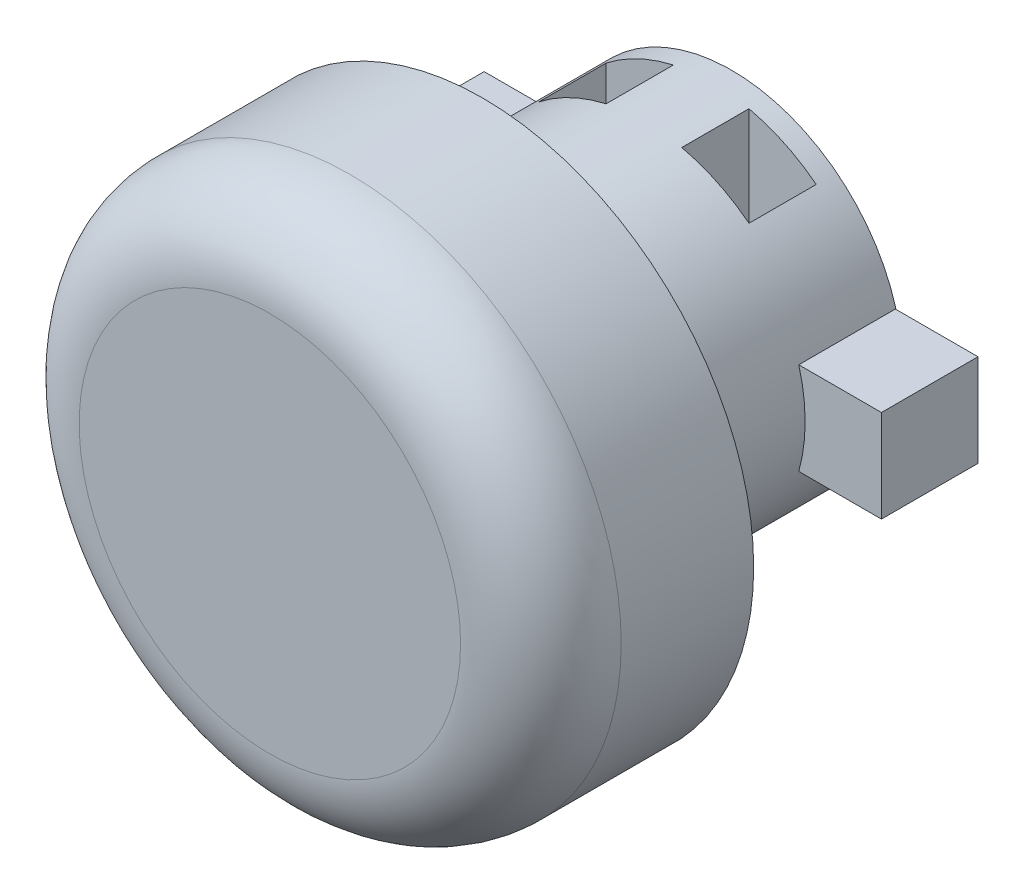
ISO-10303-21;
HEADER;
FILE_DESCRIPTION(('STEP AP214'),'2;1');
FILE_NAME('part.step','',(''),(''),'','','');
FILE_SCHEMA(('AUTOMOTIVE_DESIGN { 1 0 10303 214 1 1 1 1 }'));
ENDSEC;
DATA;
#1=APPLICATION_CONTEXT('core data for automotive mechanical design processes');
#2=APPLICATION_PROTOCOL_DEFINITION('international standard','automotive_design',2000,#1);
#3=PRODUCT_CONTEXT('',#1,'mechanical');
#4=PRODUCT('Part','Part','',(#3));
#5=PRODUCT_RELATED_PRODUCT_CATEGORY('part','',(#4));
#6=PRODUCT_DEFINITION_FORMATION('','',#4);
#7=PRODUCT_DEFINITION_CONTEXT('part definition',#1,'design');
#8=PRODUCT_DEFINITION('design','',#6,#7);
#9=PRODUCT_DEFINITION_SHAPE('','',#8);
#10=(LENGTH_UNIT() NAMED_UNIT(*) SI_UNIT(.MILLI.,.METRE.));
#11=(NAMED_UNIT(*) PLANE_ANGLE_UNIT() SI_UNIT($,.RADIAN.));
#12=(NAMED_UNIT(*) SI_UNIT($,.STERADIAN.) SOLID_ANGLE_UNIT());
#13=UNCERTAINTY_MEASURE_WITH_UNIT(LENGTH_MEASURE(1.E-05),#10,'distance_accuracy_value','');
#14=(GEOMETRIC_REPRESENTATION_CONTEXT(3) GLOBAL_UNCERTAINTY_ASSIGNED_CONTEXT((#13)) GLOBAL_UNIT_ASSIGNED_CONTEXT((#10,
#11,#12)) REPRESENTATION_CONTEXT('',''));
#15=CARTESIAN_POINT('',(0.,0.,0.));
#16=DIRECTION('',(0.,0.,1.));
#17=DIRECTION('',(1.,0.,0.));
#18=AXIS2_PLACEMENT_3D('',#15,#16,#17);
#19=CARTESIAN_POINT('',(0.,0.,76.));
#20=DIRECTION('',(0.,0.,-1.));
#21=DIRECTION('',(-1.,0.,0.));
#22=AXIS2_PLACEMENT_3D('',#19,#20,#21);
#23=CYLINDRICAL_SURFACE('',#22,42.5);
#24=CARTESIAN_POINT('',(0.,0.,5.08877359504198));
#25=DIRECTION('',(0.,0.,-1.));
#26=DIRECTION('',(-1.,0.,0.));
#27=AXIS2_PLACEMENT_3D('',#24,#25,#26);
#28=CIRCLE('',#27,42.5);
#29=CARTESIAN_POINT('',(-26.1728970811276,33.4847645710807,5.08877359504198));
#30=VERTEX_POINT('',#29);
#31=CARTESIAN_POINT('',(-9.42224294920593,41.442385763927,5.08877359504198));
#32=VERTEX_POINT('',#31);
#33=EDGE_CURVE('E181',#30,#32,#28,.T.);
#34=ORIENTED_EDGE('',*,*,#33,.T.);
#35=DIRECTION('',(0.,0.,-1.));
#36=VECTOR('',#35,1.);
#37=CARTESIAN_POINT('',(-9.42224294920593,41.442385763927,76.));
#38=LINE('',#37,#36);
#39=CARTESIAN_POINT('',(-9.42224294920593,41.442385763927,21.8394277269636));
#40=VERTEX_POINT('',#39);
#41=EDGE_CURVE('E11',#32,#40,#38,.F.);
#42=ORIENTED_EDGE('',*,*,#41,.T.);
#43=CARTESIAN_POINT('',(0.,0.,21.8394277269636));
#44=DIRECTION('',(0.,0.,1.));
#45=DIRECTION('',(1.,0.,0.));
#46=AXIS2_PLACEMENT_3D('',#43,#44,#45);
#47=CIRCLE('',#46,42.5);
#48=CARTESIAN_POINT('',(-26.1728970811276,33.4847645710807,21.8394277269636));
#49=VERTEX_POINT('',#48);
#50=EDGE_CURVE('E40',#40,#49,#47,.T.);
#51=ORIENTED_EDGE('',*,*,#50,.T.);
#52=DIRECTION('',(0.,0.,-1.));
#53=VECTOR('',#52,1.);
#54=CARTESIAN_POINT('',(-26.1728970811276,33.4847645710807,76.));
#55=LINE('',#54,#53);
#56=EDGE_CURVE('E189',#49,#30,#55,.T.);
#57=ORIENTED_EDGE('',*,*,#56,.T.);
#58=EDGE_LOOP('',(#34,#42,#51,#57));
#59=FACE_BOUND('',#58,.T.);
#60=CARTESIAN_POINT('',(-26.1728970811276,-33.4847645710807,21.8394277269636));
#61=VERTEX_POINT('',#60);
#62=CARTESIAN_POINT('',(-9.42224294920593,-41.442385763927,21.8394277269636));
#63=VERTEX_POINT('',#62);
#64=EDGE_CURVE('E184',#61,#63,#47,.T.);
#65=ORIENTED_EDGE('',*,*,#64,.T.);
#66=DIRECTION('',(0.,0.,-1.));
#67=VECTOR('',#66,1.);
#68=CARTESIAN_POINT('',(-9.42224294920593,-41.442385763927,76.));
#69=LINE('',#68,#67);
#70=CARTESIAN_POINT('',(-9.42224294920593,-41.442385763927,5.08877359504198));
#71=VERTEX_POINT('',#70);
#72=EDGE_CURVE('E187',#63,#71,#69,.T.);
#73=ORIENTED_EDGE('',*,*,#72,.T.);
#74=CARTESIAN_POINT('',(-26.1728970811276,-33.4847645710807,5.08877359504198));
#75=VERTEX_POINT('',#74);
#76=EDGE_CURVE('E177',#71,#75,#28,.T.);
#77=ORIENTED_EDGE('',*,*,#76,.T.);
#78=DIRECTION('',(0.,0.,-1.));
#79=VECTOR('',#78,1.);
#80=CARTESIAN_POINT('',(-26.1728970811276,-33.4847645710807,76.));
#81=LINE('',#80,#79);
#82=EDGE_CURVE('E180',#75,#61,#81,.F.);
#83=ORIENTED_EDGE('',*,*,#82,.T.);
#84=EDGE_LOOP('',(#65,#73,#77,#83));
#85=FACE_BOUND('',#84,.T.);
#86=CARTESIAN_POINT('',(0.,0.,5.08877359504198));
#87=DIRECTION('',(0.,0.,-1.));
#88=DIRECTION('',(-1.,0.,0.));
#89=AXIS2_PLACEMENT_3D('',#86,#87,#88);
#90=CIRCLE('',#89,42.5);
#91=CARTESIAN_POINT('',(9.42224294920593,41.442385763927,5.08877359504198));
#92=VERTEX_POINT('',#91);
#93=CARTESIAN_POINT('',(26.1728970811276,33.4847645710807,5.08877359504198));
#94=VERTEX_POINT('',#93);
#95=EDGE_CURVE('E143',#92,#94,#90,.T.);
#96=ORIENTED_EDGE('',*,*,#95,.T.);
#97=DIRECTION('',(0.,0.,-1.));
#98=VECTOR('',#97,1.);
#99=CARTESIAN_POINT('',(26.1728970811276,33.4847645710807,76.));
#100=LINE('',#99,#98);
#101=CARTESIAN_POINT('',(26.1728970811276,33.4847645710807,21.8394277269636));
#102=VERTEX_POINT('',#101);
#103=EDGE_CURVE('E171',#94,#102,#100,.F.);
#104=ORIENTED_EDGE('',*,*,#103,.T.);
#105=CARTESIAN_POINT('',(0.,0.,21.8394277269636));
#106=DIRECTION('',(0.,0.,1.));
#107=DIRECTION('',(1.,0.,0.));
#108=AXIS2_PLACEMENT_3D('',#105,#106,#107);
#109=CIRCLE('',#108,42.5);
#110=CARTESIAN_POINT('',(9.42224294920593,41.442385763927,21.8394277269636));
#111=VERTEX_POINT('',#110);
#112=EDGE_CURVE('E169',#102,#111,#109,.T.);
#113=ORIENTED_EDGE('',*,*,#112,.T.);
#114=DIRECTION('',(0.,0.,-1.));
#115=VECTOR('',#114,1.);
#116=CARTESIAN_POINT('',(9.42224294920593,41.442385763927,76.));
#117=LINE('',#116,#115);
#118=EDGE_CURVE('E154',#111,#92,#117,.T.);
#119=ORIENTED_EDGE('',*,*,#118,.T.);
#120=EDGE_LOOP('',(#96,#104,#113,#119));
#121=FACE_BOUND('',#120,.T.);
#122=CARTESIAN_POINT('',(9.42224294920593,-41.442385763927,21.8394277269636));
#123=VERTEX_POINT('',#122);
#124=CARTESIAN_POINT('',(26.1728970811276,-33.4847645710807,21.8394277269636));
#125=VERTEX_POINT('',#124);
#126=EDGE_CURVE('E173',#123,#125,#109,.T.);
#127=ORIENTED_EDGE('',*,*,#126,.T.);
#128=DIRECTION('',(0.,0.,-1.));
#129=VECTOR('',#128,1.);
#130=CARTESIAN_POINT('',(26.1728970811276,-33.4847645710807,76.));
#131=LINE('',#130,#129);
#132=CARTESIAN_POINT('',(26.1728970811276,-33.4847645710807,5.08877359504198));
#133=VERTEX_POINT('',#132);
#134=EDGE_CURVE('E155',#125,#133,#131,.T.);
#135=ORIENTED_EDGE('',*,*,#134,.T.);
#136=CARTESIAN_POINT('',(9.42224294920593,-41.442385763927,5.08877359504198));
#137=VERTEX_POINT('',#136);
#138=EDGE_CURVE('E157',#133,#137,#90,.T.);
#139=ORIENTED_EDGE('',*,*,#138,.T.);
#140=DIRECTION('',(0.,0.,-1.));
#141=VECTOR('',#140,1.);
#142=CARTESIAN_POINT('',(9.42224294920593,-41.442385763927,76.));
#143=LINE('',#142,#141);
#144=EDGE_CURVE('E163',#137,#123,#143,.F.);
#145=ORIENTED_EDGE('',*,*,#144,.T.);
#146=EDGE_LOOP('',(#127,#135,#139,#145));
#147=FACE_BOUND('',#146,.T.);
#148=DIRECTION('',(0.,0.,-1.));
#149=VECTOR('',#148,1.);
#150=CARTESIAN_POINT('',(40.9145450909576,11.5,76.));
#151=LINE('',#150,#149);
#152=CARTESIAN_POINT('',(40.9145450909576,11.5,0.130864485405641));
#153=VERTEX_POINT('',#152);
#154=CARTESIAN_POINT('',(40.9145450909576,11.5,24.1800471284872));
#155=VERTEX_POINT('',#154);
#156=EDGE_CURVE('E280',#153,#155,#151,.F.);
#157=ORIENTED_EDGE('',*,*,#156,.F.);
#158=CARTESIAN_POINT('',(0.,0.,0.130864485405641));
#159=DIRECTION('',(0.,0.,1.));
#160=DIRECTION('',(1.,0.,0.));
#161=AXIS2_PLACEMENT_3D('',#158,#159,#160);
#162=CIRCLE('',#161,42.5);
#163=CARTESIAN_POINT('',(40.9145450909576,-11.5,0.130864485405641));
#164=VERTEX_POINT('',#163);
#165=EDGE_CURVE('E277',#164,#153,#162,.T.);
#166=ORIENTED_EDGE('',*,*,#165,.F.);
#167=DIRECTION('',(0.,0.,-1.));
#168=VECTOR('',#167,1.);
#169=CARTESIAN_POINT('',(40.9145450909576,-11.5,76.));
#170=LINE('',#169,#168);
#171=CARTESIAN_POINT('',(40.9145450909576,-11.5,24.1800471284872));
#172=VERTEX_POINT('',#171);
#173=EDGE_CURVE('E271',#164,#172,#170,.F.);
#174=ORIENTED_EDGE('',*,*,#173,.T.);
#175=CARTESIAN_POINT('',(0.,0.,24.1800471284872));
#176=DIRECTION('',(0.,0.,-1.));
#177=DIRECTION('',(-1.,0.,0.));
#178=AXIS2_PLACEMENT_3D('',#175,#176,#177);
#179=CIRCLE('',#178,42.5);
#180=EDGE_CURVE('E274',#155,#172,#179,.T.);
#181=ORIENTED_EDGE('',*,*,#180,.F.);
#182=EDGE_LOOP('',(#157,#166,#174,#181));
#183=FACE_BOUND('',#182,.T.);
#184=CARTESIAN_POINT('',(0.,0.,76.));
#185=DIRECTION('',(0.,0.,1.));
#186=DIRECTION('',(1.,0.,0.));
#187=AXIS2_PLACEMENT_3D('',#184,#185,#186);
#188=CIRCLE('',#187,42.5);
#189=CARTESIAN_POINT('',(42.5,0.,76.));
#190=VERTEX_POINT('',#189);
#191=EDGE_CURVE('E260',#190,#190,#188,.T.);
#192=ORIENTED_EDGE('',*,*,#191,.F.);
#193=EDGE_LOOP('',(#192));
#194=FACE_BOUND('',#193,.T.);
#195=CARTESIAN_POINT('',(0.,0.,0.));
#196=DIRECTION('',(0.,0.,1.));
#197=DIRECTION('',(1.,0.,0.));
#198=AXIS2_PLACEMENT_3D('',#195,#196,#197);
#199=CIRCLE('',#198,42.5);
#200=CARTESIAN_POINT('',(42.5,0.,0.));
#201=VERTEX_POINT('',#200);
#202=EDGE_CURVE('E259',#201,#201,#199,.T.);
#203=ORIENTED_EDGE('',*,*,#202,.T.);
#204=EDGE_LOOP('',(#203));
#205=FACE_BOUND('',#204,.T.);
#206=DIRECTION('',(0.,0.,-1.));
#207=VECTOR('',#206,1.);
#208=CARTESIAN_POINT('',(-40.9145450909576,11.5,76.));
#209=LINE('',#208,#207);
#210=CARTESIAN_POINT('',(-40.9145450909576,11.5,24.1800471284872));
#211=VERTEX_POINT('',#210);
#212=CARTESIAN_POINT('',(-40.9145450909576,11.5,0.130864485405641));
#213=VERTEX_POINT('',#212);
#214=EDGE_CURVE('E286',#211,#213,#209,.T.);
#215=ORIENTED_EDGE('',*,*,#214,.F.);
#216=CARTESIAN_POINT('',(-40.9145450909576,-11.5,24.1800471284872));
#217=VERTEX_POINT('',#216);
#218=EDGE_CURVE('E278',#217,#211,#179,.T.);
#219=ORIENTED_EDGE('',*,*,#218,.F.);
#220=DIRECTION('',(0.,0.,-1.));
#221=VECTOR('',#220,1.);
#222=CARTESIAN_POINT('',(-40.9145450909576,-11.5,76.));
#223=LINE('',#222,#221);
#224=CARTESIAN_POINT('',(-40.9145450909576,-11.5,0.130864485405641));
#225=VERTEX_POINT('',#224);
#226=EDGE_CURVE('E283',#217,#225,#223,.T.);
#227=ORIENTED_EDGE('',*,*,#226,.T.);
#228=EDGE_CURVE('E281',#213,#225,#162,.T.);
#229=ORIENTED_EDGE('',*,*,#228,.F.);
#230=EDGE_LOOP('',(#215,#219,#227,#229));
#231=FACE_BOUND('',#230,.T.);
#232=ADVANCED_FACE('F32',(#59,#85,#121,#147,#183,#194,#205,#231),#23,.T.);
#233=CARTESIAN_POINT('',(0.,0.,115.));
#234=DIRECTION('',(0.,0.,-1.));
#235=DIRECTION('',(-1.,0.,0.));
#236=AXIS2_PLACEMENT_3D('',#233,#234,#235);
#237=CYLINDRICAL_SURFACE('',#236,67.5);
#238=CARTESIAN_POINT('',(0.,0.,95.));
#239=DIRECTION('',(0.,0.,1.));
#240=DIRECTION('',(1.,0.,0.));
#241=AXIS2_PLACEMENT_3D('',#238,#239,#240);
#242=CIRCLE('',#241,67.5);
#243=CARTESIAN_POINT('',(67.5,0.,95.));
#244=VERTEX_POINT('',#243);
#245=EDGE_CURVE('E268',#244,#244,#242,.F.);
#246=ORIENTED_EDGE('',*,*,#245,.T.);
#247=EDGE_LOOP('',(#246));
#248=FACE_BOUND('',#247,.T.);
#249=CARTESIAN_POINT('',(0.,0.,62.));
#250=DIRECTION('',(0.,0.,-1.));
#251=DIRECTION('',(-1.,0.,0.));
#252=AXIS2_PLACEMENT_3D('',#249,#250,#251);
#253=CIRCLE('',#252,67.5);
#254=CARTESIAN_POINT('',(-67.5,0.,62.));
#255=VERTEX_POINT('',#254);
#256=EDGE_CURVE('E254',#255,#255,#253,.T.);
#257=ORIENTED_EDGE('',*,*,#256,.F.);
#258=EDGE_LOOP('',(#257));
#259=FACE_BOUND('',#258,.T.);
#260=ADVANCED_FACE('F307',(#248,#259),#237,.T.);
#261=CARTESIAN_POINT('',(0.,0.,115.));
#262=DIRECTION('',(0.,0.,1.));
#263=DIRECTION('',(1.,0.,0.));
#264=AXIS2_PLACEMENT_3D('',#261,#262,#263);
#265=PLANE('',#264);
#266=CARTESIAN_POINT('',(0.,0.,115.));
#267=DIRECTION('',(0.,0.,1.));
#268=DIRECTION('',(1.,0.,0.));
#269=AXIS2_PLACEMENT_3D('',#266,#267,#268);
#270=CIRCLE('',#269,47.5);
#271=CARTESIAN_POINT('',(47.5,0.,115.));
#272=VERTEX_POINT('',#271);
#273=EDGE_CURVE('E263',#272,#272,#270,.T.);
#274=ORIENTED_EDGE('',*,*,#273,.T.);
#275=EDGE_LOOP('',(#274));
#276=FACE_BOUND('',#275,.T.);
#277=ADVANCED_FACE('F311',(#276),#265,.T.);
#278=CARTESIAN_POINT('',(0.,0.,95.));
#279=DIRECTION('',(0.,0.,1.));
#280=DIRECTION('',(1.,0.,0.));
#281=AXIS2_PLACEMENT_3D('',#278,#279,#280);
#282=TOROIDAL_SURFACE('',#281,47.5,20.);
#283=ORIENTED_EDGE('',*,*,#245,.F.);
#284=EDGE_LOOP('',(#283));
#285=FACE_BOUND('',#284,.T.);
#286=ORIENTED_EDGE('',*,*,#273,.F.);
#287=EDGE_LOOP('',(#286));
#288=FACE_BOUND('',#287,.T.);
#289=ADVANCED_FACE('F34',(#285,#288),#282,.T.);
#290=CARTESIAN_POINT('',(0.,0.,62.));
#291=DIRECTION('',(0.,0.,-1.));
#292=DIRECTION('',(-1.,0.,0.));
#293=AXIS2_PLACEMENT_3D('',#290,#291,#292);
#294=PLANE('',#293);
#295=ORIENTED_EDGE('',*,*,#256,.T.);
#296=EDGE_LOOP('',(#295));
#297=FACE_BOUND('',#296,.T.);
#298=CARTESIAN_POINT('',(0.,0.,62.));
#299=DIRECTION('',(0.,0.,-1.));
#300=DIRECTION('',(-1.,0.,0.));
#301=AXIS2_PLACEMENT_3D('',#298,#299,#300);
#302=CIRCLE('',#301,62.5);
#303=CARTESIAN_POINT('',(-62.5,0.,62.));
#304=VERTEX_POINT('',#303);
#305=EDGE_CURVE('E251',#304,#304,#302,.T.);
#306=ORIENTED_EDGE('',*,*,#305,.F.);
#307=EDGE_LOOP('',(#306));
#308=FACE_BOUND('',#307,.T.);
#309=ADVANCED_FACE('F328',(#297,#308),#294,.T.);
#310=CARTESIAN_POINT('',(0.,0.,62.));
#311=DIRECTION('',(0.,0.,1.));
#312=DIRECTION('',(1.,0.,0.));
#313=AXIS2_PLACEMENT_3D('',#310,#311,#312);
#314=CYLINDRICAL_SURFACE('',#313,62.5);
#315=ORIENTED_EDGE('',*,*,#305,.T.);
#316=EDGE_LOOP('',(#315));
#317=FACE_BOUND('',#316,.T.);
#318=CARTESIAN_POINT('',(0.,0.,76.));
#319=DIRECTION('',(0.,0.,-1.));
#320=DIRECTION('',(-1.,0.,0.));
#321=AXIS2_PLACEMENT_3D('',#318,#319,#320);
#322=CIRCLE('',#321,62.5);
#323=CARTESIAN_POINT('',(-62.5,0.,76.));
#324=VERTEX_POINT('',#323);
#325=EDGE_CURVE('E250',#324,#324,#322,.T.);
#326=ORIENTED_EDGE('',*,*,#325,.F.);
#327=EDGE_LOOP('',(#326));
#328=FACE_BOUND('',#327,.T.);
#329=ADVANCED_FACE('F318',(#317,#328),#314,.F.);
#330=CARTESIAN_POINT('',(0.,0.,0.));
#331=DIRECTION('',(0.,0.,1.));
#332=DIRECTION('',(1.,0.,0.));
#333=AXIS2_PLACEMENT_3D('',#330,#331,#332);
#334=PLANE('',#333);
#335=ORIENTED_EDGE('',*,*,#202,.F.);
#336=EDGE_LOOP('',(#335));
#337=FACE_BOUND('',#336,.T.);
#338=ADVANCED_FACE('F315',(#337),#334,.F.);
#339=CARTESIAN_POINT('',(0.,0.,76.));
#340=DIRECTION('',(0.,0.,1.));
#341=DIRECTION('',(1.,0.,0.));
#342=AXIS2_PLACEMENT_3D('',#339,#340,#341);
#343=PLANE('',#342);
#344=ORIENTED_EDGE('',*,*,#191,.T.);
#345=EDGE_LOOP('',(#344));
#346=FACE_BOUND('',#345,.T.);
#347=ORIENTED_EDGE('',*,*,#325,.T.);
#348=EDGE_LOOP('',(#347));
#349=FACE_BOUND('',#348,.T.);
#350=ADVANCED_FACE('F317',(#346,#349),#343,.F.);
#351=CARTESIAN_POINT('',(61.5,11.5,24.1800471284872));
#352=DIRECTION('',(-1.,0.,0.));
#353=DIRECTION('',(0.,0.,1.));
#354=AXIS2_PLACEMENT_3D('',#351,#352,#353);
#355=PLANE('',#354);
#356=DIRECTION('',(0.,0.,-1.));
#357=VECTOR('',#356,1.);
#358=CARTESIAN_POINT('',(61.5,-11.5,24.1800471284872));
#359=LINE('',#358,#357);
#360=CARTESIAN_POINT('',(61.5,-11.5,24.1800471284872));
#361=VERTEX_POINT('',#360);
#362=CARTESIAN_POINT('',(61.5,-11.5,0.130864485405641));
#363=VERTEX_POINT('',#362);
#364=EDGE_CURVE('E227',#361,#363,#359,.T.);
#365=ORIENTED_EDGE('',*,*,#364,.T.);
#366=DIRECTION('',(0.,-1.,0.));
#367=VECTOR('',#366,1.);
#368=CARTESIAN_POINT('',(61.5,11.5,0.130864485405641));
#369=LINE('',#368,#367);
#370=CARTESIAN_POINT('',(61.5,11.5,0.130864485405641));
#371=VERTEX_POINT('',#370);
#372=EDGE_CURVE('E247',#371,#363,#369,.T.);
#373=ORIENTED_EDGE('',*,*,#372,.F.);
#374=DIRECTION('',(0.,0.,-1.));
#375=VECTOR('',#374,1.);
#376=CARTESIAN_POINT('',(61.5,11.5,24.1800471284872));
#377=LINE('',#376,#375);
#378=CARTESIAN_POINT('',(61.5,11.5,24.1800471284872));
#379=VERTEX_POINT('',#378);
#380=EDGE_CURVE('E212',#379,#371,#377,.T.);
#381=ORIENTED_EDGE('',*,*,#380,.F.);
#382=DIRECTION('',(0.,-1.,0.));
#383=VECTOR('',#382,1.);
#384=CARTESIAN_POINT('',(61.5,11.5,24.1800471284872));
#385=LINE('',#384,#383);
#386=EDGE_CURVE('E226',#379,#361,#385,.T.);
#387=ORIENTED_EDGE('',*,*,#386,.T.);
#388=EDGE_LOOP('',(#365,#373,#381,#387));
#389=FACE_BOUND('',#388,.T.);
#390=ADVANCED_FACE('F323',(#389),#355,.F.);
#391=CARTESIAN_POINT('',(0.,-11.5,0.));
#392=DIRECTION('',(0.,-1.,0.));
#393=DIRECTION('',(0.,0.,-1.));
#394=AXIS2_PLACEMENT_3D('',#391,#392,#393);
#395=PLANE('',#394);
#396=ORIENTED_EDGE('',*,*,#173,.F.);
#397=DIRECTION('',(-1.,0.,0.));
#398=VECTOR('',#397,1.);
#399=CARTESIAN_POINT('',(-61.5,-11.5,0.130864485405641));
#400=LINE('',#399,#398);
#401=EDGE_CURVE('E231',#363,#164,#400,.T.);
#402=ORIENTED_EDGE('',*,*,#401,.F.);
#403=ORIENTED_EDGE('',*,*,#364,.F.);
#404=DIRECTION('',(1.,0.,0.));
#405=VECTOR('',#404,1.);
#406=CARTESIAN_POINT('',(-61.5,-11.5,24.1800471284872));
#407=LINE('',#406,#405);
#408=EDGE_CURVE('E236',#172,#361,#407,.T.);
#409=ORIENTED_EDGE('',*,*,#408,.F.);
#410=EDGE_LOOP('',(#396,#402,#403,#409));
#411=FACE_BOUND('',#410,.T.);
#412=ADVANCED_FACE('F337',(#411),#395,.T.);
#413=CARTESIAN_POINT('',(0.,11.5,0.));
#414=DIRECTION('',(0.,-1.,0.));
#415=DIRECTION('',(0.,0.,-1.));
#416=AXIS2_PLACEMENT_3D('',#413,#414,#415);
#417=PLANE('',#416);
#418=DIRECTION('',(-1.,0.,0.));
#419=VECTOR('',#418,1.);
#420=CARTESIAN_POINT('',(-61.5,11.5,0.130864485405641));
#421=LINE('',#420,#419);
#422=EDGE_CURVE('E217',#371,#153,#421,.T.);
#423=ORIENTED_EDGE('',*,*,#422,.T.);
#424=ORIENTED_EDGE('',*,*,#156,.T.);
#425=DIRECTION('',(1.,0.,0.));
#426=VECTOR('',#425,1.);
#427=CARTESIAN_POINT('',(-61.5,11.5,24.1800471284872));
#428=LINE('',#427,#426);
#429=EDGE_CURVE('E222',#155,#379,#428,.T.);
#430=ORIENTED_EDGE('',*,*,#429,.T.);
#431=ORIENTED_EDGE('',*,*,#380,.T.);
#432=EDGE_LOOP('',(#423,#424,#430,#431));
#433=FACE_BOUND('',#432,.T.);
#434=ADVANCED_FACE('F359',(#433),#417,.F.);
#435=CARTESIAN_POINT('',(-61.5,11.5,24.1800471284872));
#436=DIRECTION('',(0.,0.,-1.));
#437=DIRECTION('',(-1.,0.,0.));
#438=AXIS2_PLACEMENT_3D('',#435,#436,#437);
#439=PLANE('',#438);
#440=ORIENTED_EDGE('',*,*,#429,.F.);
#441=ORIENTED_EDGE('',*,*,#180,.T.);
#442=ORIENTED_EDGE('',*,*,#408,.T.);
#443=ORIENTED_EDGE('',*,*,#386,.F.);
#444=EDGE_LOOP('',(#440,#441,#442,#443));
#445=FACE_BOUND('',#444,.T.);
#446=ADVANCED_FACE('F343',(#445),#439,.F.);
#447=CARTESIAN_POINT('',(-61.5,11.5,0.130864485405641));
#448=DIRECTION('',(0.,0.,1.));
#449=DIRECTION('',(1.,0.,0.));
#450=AXIS2_PLACEMENT_3D('',#447,#448,#449);
#451=PLANE('',#450);
#452=ORIENTED_EDGE('',*,*,#401,.T.);
#453=ORIENTED_EDGE('',*,*,#165,.T.);
#454=ORIENTED_EDGE('',*,*,#422,.F.);
#455=ORIENTED_EDGE('',*,*,#372,.T.);
#456=EDGE_LOOP('',(#452,#453,#454,#455));
#457=FACE_BOUND('',#456,.T.);
#458=ADVANCED_FACE('F339',(#457),#451,.F.);
#459=CARTESIAN_POINT('',(-61.5,11.5,0.130864485405641));
#460=VERTEX_POINT('',#459);
#461=EDGE_CURVE('E215',#213,#460,#421,.T.);
#462=ORIENTED_EDGE('',*,*,#461,.F.);
#463=ORIENTED_EDGE('',*,*,#228,.T.);
#464=CARTESIAN_POINT('',(-61.5,-11.5,0.130864485405641));
#465=VERTEX_POINT('',#464);
#466=EDGE_CURVE('E230',#225,#465,#400,.T.);
#467=ORIENTED_EDGE('',*,*,#466,.T.);
#468=DIRECTION('',(0.,-1.,0.));
#469=VECTOR('',#468,1.);
#470=CARTESIAN_POINT('',(-61.5,11.5,0.130864485405641));
#471=LINE('',#470,#469);
#472=EDGE_CURVE('E244',#460,#465,#471,.T.);
#473=ORIENTED_EDGE('',*,*,#472,.F.);
#474=EDGE_LOOP('',(#462,#463,#467,#473));
#475=FACE_BOUND('',#474,.T.);
#476=ADVANCED_FACE('F342',(#475),#451,.F.);
#477=CARTESIAN_POINT('',(-61.5,11.5,24.1800471284872));
#478=VERTEX_POINT('',#477);
#479=EDGE_CURVE('E223',#478,#211,#428,.T.);
#480=ORIENTED_EDGE('',*,*,#479,.T.);
#481=ORIENTED_EDGE('',*,*,#214,.T.);
#482=ORIENTED_EDGE('',*,*,#461,.T.);
#483=DIRECTION('',(0.,0.,1.));
#484=VECTOR('',#483,1.);
#485=CARTESIAN_POINT('',(-61.5,11.5,24.1800471284872));
#486=LINE('',#485,#484);
#487=EDGE_CURVE('E220',#460,#478,#486,.T.);
#488=ORIENTED_EDGE('',*,*,#487,.T.);
#489=EDGE_LOOP('',(#480,#481,#482,#488));
#490=FACE_BOUND('',#489,.T.);
#491=ADVANCED_FACE('F355',(#490),#417,.F.);
#492=ORIENTED_EDGE('',*,*,#226,.F.);
#493=CARTESIAN_POINT('',(-61.5,-11.5,24.1800471284872));
#494=VERTEX_POINT('',#493);
#495=EDGE_CURVE('E216',#494,#217,#407,.T.);
#496=ORIENTED_EDGE('',*,*,#495,.F.);
#497=DIRECTION('',(0.,0.,1.));
#498=VECTOR('',#497,1.);
#499=CARTESIAN_POINT('',(-61.5,-11.5,24.1800471284872));
#500=LINE('',#499,#498);
#501=EDGE_CURVE('E234',#465,#494,#500,.T.);
#502=ORIENTED_EDGE('',*,*,#501,.F.);
#503=ORIENTED_EDGE('',*,*,#466,.F.);
#504=EDGE_LOOP('',(#492,#496,#502,#503));
#505=FACE_BOUND('',#504,.T.);
#506=ADVANCED_FACE('F348',(#505),#395,.T.);
#507=CARTESIAN_POINT('',(-61.5,11.5,24.1800471284872));
#508=DIRECTION('',(1.,0.,0.));
#509=DIRECTION('',(0.,0.,-1.));
#510=AXIS2_PLACEMENT_3D('',#507,#508,#509);
#511=PLANE('',#510);
#512=ORIENTED_EDGE('',*,*,#501,.T.);
#513=DIRECTION('',(0.,-1.,0.));
#514=VECTOR('',#513,1.);
#515=CARTESIAN_POINT('',(-61.5,11.5,24.1800471284872));
#516=LINE('',#515,#514);
#517=EDGE_CURVE('E241',#478,#494,#516,.T.);
#518=ORIENTED_EDGE('',*,*,#517,.F.);
#519=ORIENTED_EDGE('',*,*,#487,.F.);
#520=ORIENTED_EDGE('',*,*,#472,.T.);
#521=EDGE_LOOP('',(#512,#518,#519,#520));
#522=FACE_BOUND('',#521,.T.);
#523=ADVANCED_FACE('F345',(#522),#511,.F.);
#524=ORIENTED_EDGE('',*,*,#495,.T.);
#525=ORIENTED_EDGE('',*,*,#218,.T.);
#526=ORIENTED_EDGE('',*,*,#479,.F.);
#527=ORIENTED_EDGE('',*,*,#517,.T.);
#528=EDGE_LOOP('',(#524,#525,#526,#527));
#529=FACE_BOUND('',#528,.T.);
#530=ADVANCED_FACE('F303',(#529),#439,.F.);
#531=CARTESIAN_POINT('',(26.1728970811276,-67.5,5.08877359504198));
#532=DIRECTION('',(1.,0.,0.));
#533=DIRECTION('',(0.,0.,-1.));
#534=AXIS2_PLACEMENT_3D('',#531,#532,#533);
#535=PLANE('',#534);
#536=DIRECTION('',(0.,1.,0.));
#537=VECTOR('',#536,1.);
#538=CARTESIAN_POINT('',(26.1728970811276,-67.5,21.8394277269636));
#539=LINE('',#538,#537);
#540=EDGE_CURVE('E204',#125,#102,#539,.T.);
#541=ORIENTED_EDGE('',*,*,#540,.T.);
#542=ORIENTED_EDGE('',*,*,#103,.F.);
#543=DIRECTION('',(0.,1.,0.));
#544=VECTOR('',#543,1.);
#545=CARTESIAN_POINT('',(26.1728970811276,-67.5,5.08877359504198));
#546=LINE('',#545,#544);
#547=EDGE_CURVE('E149',#133,#94,#546,.T.);
#548=ORIENTED_EDGE('',*,*,#547,.F.);
#549=ORIENTED_EDGE('',*,*,#134,.F.);
#550=EDGE_LOOP('',(#541,#542,#548,#549));
#551=FACE_BOUND('',#550,.T.);
#552=ADVANCED_FACE('F293',(#551),#535,.F.);
#553=CARTESIAN_POINT('',(26.1728970811276,-67.5,21.8394277269636));
#554=DIRECTION('',(0.,0.,1.));
#555=DIRECTION('',(1.,0.,0.));
#556=AXIS2_PLACEMENT_3D('',#553,#554,#555);
#557=PLANE('',#556);
#558=ORIENTED_EDGE('',*,*,#540,.F.);
#559=ORIENTED_EDGE('',*,*,#126,.F.);
#560=DIRECTION('',(0.,1.,0.));
#561=VECTOR('',#560,1.);
#562=CARTESIAN_POINT('',(9.42224294920593,-67.5,21.8394277269636));
#563=LINE('',#562,#561);
#564=EDGE_CURVE('E165',#123,#111,#563,.T.);
#565=ORIENTED_EDGE('',*,*,#564,.T.);
#566=ORIENTED_EDGE('',*,*,#112,.F.);
#567=EDGE_LOOP('',(#558,#559,#565,#566));
#568=FACE_BOUND('',#567,.T.);
#569=ADVANCED_FACE('F295',(#568),#557,.F.);
#570=CARTESIAN_POINT('',(9.42224294920593,-67.5,5.08877359504198));
#571=DIRECTION('',(-1.,0.,0.));
#572=DIRECTION('',(0.,0.,1.));
#573=AXIS2_PLACEMENT_3D('',#570,#571,#572);
#574=PLANE('',#573);
#575=ORIENTED_EDGE('',*,*,#564,.F.);
#576=ORIENTED_EDGE('',*,*,#144,.F.);
#577=DIRECTION('',(0.,1.,0.));
#578=VECTOR('',#577,1.);
#579=CARTESIAN_POINT('',(9.42224294920593,-67.5,5.08877359504198));
#580=LINE('',#579,#578);
#581=EDGE_CURVE('E146',#137,#92,#580,.T.);
#582=ORIENTED_EDGE('',*,*,#581,.T.);
#583=ORIENTED_EDGE('',*,*,#118,.F.);
#584=EDGE_LOOP('',(#575,#576,#582,#583));
#585=FACE_BOUND('',#584,.T.);
#586=ADVANCED_FACE('F160',(#585),#574,.F.);
#587=CARTESIAN_POINT('',(26.1728970811276,-67.5,5.08877359504198));
#588=DIRECTION('',(0.,0.,-1.));
#589=DIRECTION('',(-1.,0.,0.));
#590=AXIS2_PLACEMENT_3D('',#587,#588,#589);
#591=PLANE('',#590);
#592=ORIENTED_EDGE('',*,*,#581,.F.);
#593=ORIENTED_EDGE('',*,*,#138,.F.);
#594=ORIENTED_EDGE('',*,*,#547,.T.);
#595=ORIENTED_EDGE('',*,*,#95,.F.);
#596=EDGE_LOOP('',(#592,#593,#594,#595));
#597=FACE_BOUND('',#596,.T.);
#598=ADVANCED_FACE('F145',(#597),#591,.F.);
#599=CARTESIAN_POINT('',(-9.42224294920593,-67.5,5.08877359504198));
#600=DIRECTION('',(1.,0.,0.));
#601=DIRECTION('',(0.,0.,-1.));
#602=AXIS2_PLACEMENT_3D('',#599,#600,#601);
#603=PLANE('',#602);
#604=DIRECTION('',(0.,1.,0.));
#605=VECTOR('',#604,1.);
#606=CARTESIAN_POINT('',(-9.42224294920593,-67.5,21.8394277269636));
#607=LINE('',#606,#605);
#608=EDGE_CURVE('E202',#63,#40,#607,.T.);
#609=ORIENTED_EDGE('',*,*,#608,.T.);
#610=ORIENTED_EDGE('',*,*,#41,.F.);
#611=DIRECTION('',(0.,1.,0.));
#612=VECTOR('',#611,1.);
#613=CARTESIAN_POINT('',(-9.42224294920593,-67.5,5.08877359504198));
#614=LINE('',#613,#612);
#615=EDGE_CURVE('E47',#71,#32,#614,.T.);
#616=ORIENTED_EDGE('',*,*,#615,.F.);
#617=ORIENTED_EDGE('',*,*,#72,.F.);
#618=EDGE_LOOP('',(#609,#610,#616,#617));
#619=FACE_BOUND('',#618,.T.);
#620=ADVANCED_FACE('F362',(#619),#603,.F.);
#621=CARTESIAN_POINT('',(-26.1728970811276,-67.5,21.8394277269636));
#622=DIRECTION('',(0.,0.,1.));
#623=DIRECTION('',(1.,0.,0.));
#624=AXIS2_PLACEMENT_3D('',#621,#622,#623);
#625=PLANE('',#624);
#626=ORIENTED_EDGE('',*,*,#608,.F.);
#627=ORIENTED_EDGE('',*,*,#64,.F.);
#628=DIRECTION('',(0.,1.,0.));
#629=VECTOR('',#628,1.);
#630=CARTESIAN_POINT('',(-26.1728970811276,-67.5,21.8394277269636));
#631=LINE('',#630,#629);
#632=EDGE_CURVE('E200',#61,#49,#631,.T.);
#633=ORIENTED_EDGE('',*,*,#632,.T.);
#634=ORIENTED_EDGE('',*,*,#50,.F.);
#635=EDGE_LOOP('',(#626,#627,#633,#634));
#636=FACE_BOUND('',#635,.T.);
#637=ADVANCED_FACE('F366',(#636),#625,.F.);
#638=CARTESIAN_POINT('',(-26.1728970811276,-67.5,5.08877359504198));
#639=DIRECTION('',(-1.,0.,0.));
#640=DIRECTION('',(0.,0.,1.));
#641=AXIS2_PLACEMENT_3D('',#638,#639,#640);
#642=PLANE('',#641);
#643=ORIENTED_EDGE('',*,*,#632,.F.);
#644=ORIENTED_EDGE('',*,*,#82,.F.);
#645=DIRECTION('',(0.,1.,0.));
#646=VECTOR('',#645,1.);
#647=CARTESIAN_POINT('',(-26.1728970811276,-67.5,5.08877359504198));
#648=LINE('',#647,#646);
#649=EDGE_CURVE('E52',#75,#30,#648,.T.);
#650=ORIENTED_EDGE('',*,*,#649,.T.);
#651=ORIENTED_EDGE('',*,*,#56,.F.);
#652=EDGE_LOOP('',(#643,#644,#650,#651));
#653=FACE_BOUND('',#652,.T.);
#654=ADVANCED_FACE('F198',(#653),#642,.F.);
#655=CARTESIAN_POINT('',(-26.1728970811276,-67.5,5.08877359504198));
#656=DIRECTION('',(0.,0.,-1.));
#657=DIRECTION('',(-1.,0.,0.));
#658=AXIS2_PLACEMENT_3D('',#655,#656,#657);
#659=PLANE('',#658);
#660=ORIENTED_EDGE('',*,*,#649,.F.);
#661=ORIENTED_EDGE('',*,*,#76,.F.);
#662=ORIENTED_EDGE('',*,*,#615,.T.);
#663=ORIENTED_EDGE('',*,*,#33,.F.);
#664=EDGE_LOOP('',(#660,#661,#662,#663));
#665=FACE_BOUND('',#664,.T.);
#666=ADVANCED_FACE('F195',(#665),#659,.F.);
#667=CLOSED_SHELL('',(#232,#260,#277,#289,#309,#329,#338,#350,#390,#412,#434,#446,#458,#476,
#491,#506,#523,#530,#552,#569,#586,#598,#620,#637,#654,#666));
#668=MANIFOLD_SOLID_BREP('B2',#667);
#669=ADVANCED_BREP_SHAPE_REPRESENTATION('',(#18,#668),#14);
#670=SHAPE_DEFINITION_REPRESENTATION(#9,#669);
ENDSEC;
END-ISO-10303-21;
